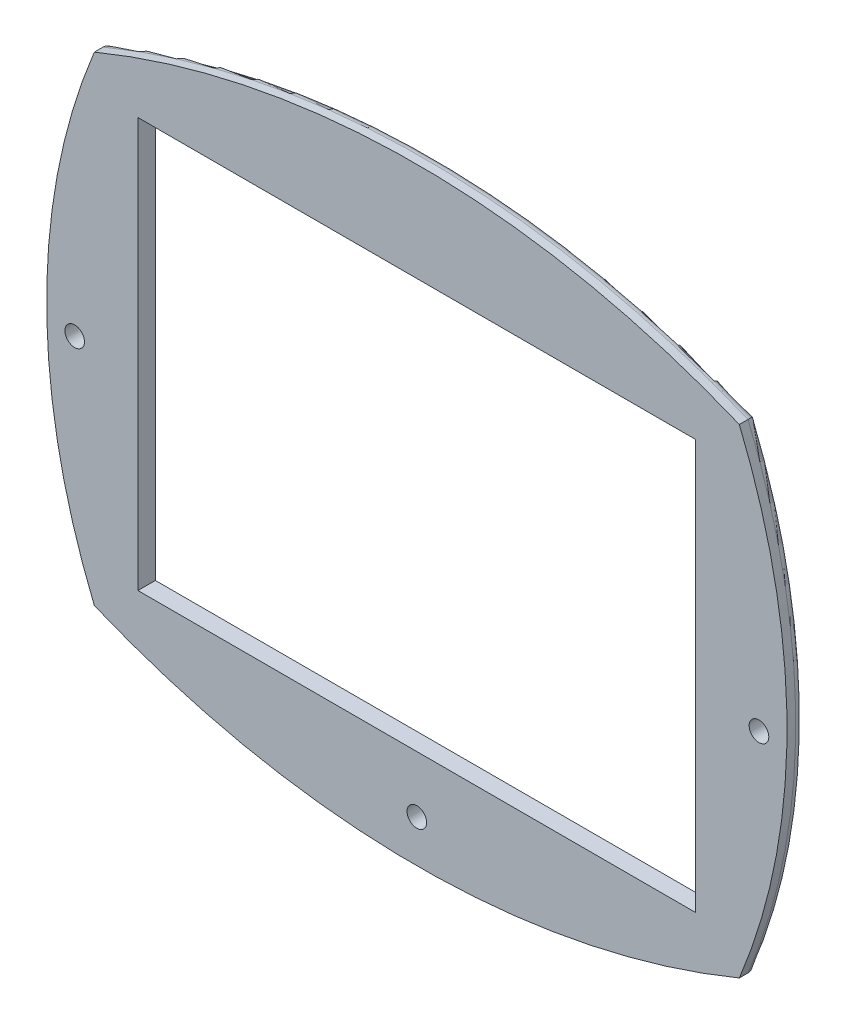
ISO-10303-21;
HEADER;
FILE_DESCRIPTION(('STEP AP214'),'2;1');
FILE_NAME('part.step','',(''),(''),'','','');
FILE_SCHEMA(('AUTOMOTIVE_DESIGN { 1 0 10303 214 1 1 1 1 }'));
ENDSEC;
DATA;
#1=APPLICATION_CONTEXT('core data for automotive mechanical design processes');
#2=APPLICATION_PROTOCOL_DEFINITION('international standard','automotive_design',2000,#1);
#3=PRODUCT_CONTEXT('',#1,'mechanical');
#4=PRODUCT('Part','Part','',(#3));
#5=PRODUCT_RELATED_PRODUCT_CATEGORY('part','',(#4));
#6=PRODUCT_DEFINITION_FORMATION('','',#4);
#7=PRODUCT_DEFINITION_CONTEXT('part definition',#1,'design');
#8=PRODUCT_DEFINITION('design','',#6,#7);
#9=PRODUCT_DEFINITION_SHAPE('','',#8);
#10=(LENGTH_UNIT() NAMED_UNIT(*) SI_UNIT(.MILLI.,.METRE.));
#11=(NAMED_UNIT(*) PLANE_ANGLE_UNIT() SI_UNIT($,.RADIAN.));
#12=(NAMED_UNIT(*) SI_UNIT($,.STERADIAN.) SOLID_ANGLE_UNIT());
#13=UNCERTAINTY_MEASURE_WITH_UNIT(LENGTH_MEASURE(1.E-05),#10,'distance_accuracy_value','');
#14=(GEOMETRIC_REPRESENTATION_CONTEXT(3) GLOBAL_UNCERTAINTY_ASSIGNED_CONTEXT((#13)) GLOBAL_UNIT_ASSIGNED_CONTEXT((#10,
#11,#12)) REPRESENTATION_CONTEXT('',''));
#15=CARTESIAN_POINT('',(0.,0.,0.));
#16=DIRECTION('',(0.,0.,1.));
#17=DIRECTION('',(1.,0.,0.));
#18=AXIS2_PLACEMENT_3D('',#15,#16,#17);
#19=CARTESIAN_POINT('',(-29.3908729652599,0.,2.));
#20=DIRECTION('',(0.,0.,-1.));
#21=DIRECTION('',(-1.,0.,0.));
#22=AXIS2_PLACEMENT_3D('',#19,#20,#21);
#23=CYLINDRICAL_SURFACE('',#22,71.8609630682005);
#24=DIRECTION('',(0.,0.,-1.));
#25=VECTOR('',#24,1.);
#26=CARTESIAN_POINT('',(36.9999999999999,-27.5,2.));
#27=LINE('',#26,#25);
#28=CARTESIAN_POINT('',(36.9999999999999,-27.5,2.));
#29=VERTEX_POINT('',#28);
#30=CARTESIAN_POINT('',(36.9999999999999,-27.5,1.));
#31=VERTEX_POINT('',#30);
#32=EDGE_CURVE('E144',#29,#31,#27,.T.);
#33=ORIENTED_EDGE('',*,*,#32,.T.);
#34=CARTESIAN_POINT('',(-29.3908729652599,0.,1.));
#35=DIRECTION('',(0.,0.,1.));
#36=DIRECTION('',(1.,0.,0.));
#37=AXIS2_PLACEMENT_3D('',#34,#35,#36);
#38=CIRCLE('',#37,71.8609630682005);
#39=CARTESIAN_POINT('',(37.,27.5,1.));
#40=VERTEX_POINT('',#39);
#41=EDGE_CURVE('E48',#31,#40,#38,.T.);
#42=ORIENTED_EDGE('',*,*,#41,.T.);
#43=DIRECTION('',(0.,0.,-1.));
#44=VECTOR('',#43,1.);
#45=CARTESIAN_POINT('',(37.,27.5,2.));
#46=LINE('',#45,#44);
#47=CARTESIAN_POINT('',(37.,27.5,2.));
#48=VERTEX_POINT('',#47);
#49=EDGE_CURVE('E156',#48,#40,#46,.T.);
#50=ORIENTED_EDGE('',*,*,#49,.F.);
#51=CARTESIAN_POINT('',(-29.3908729652599,0.,2.));
#52=DIRECTION('',(0.,0.,1.));
#53=DIRECTION('',(1.,0.,0.));
#54=AXIS2_PLACEMENT_3D('',#51,#52,#53);
#55=CIRCLE('',#54,71.8609630682005);
#56=EDGE_CURVE('E274',#48,#29,#55,.F.);
#57=ORIENTED_EDGE('',*,*,#56,.T.);
#58=EDGE_LOOP('',(#33,#42,#50,#57));
#59=FACE_BOUND('',#58,.T.);
#60=ADVANCED_FACE('F35',(#59),#23,.T.);
#61=CARTESIAN_POINT('',(0.,-61.8259018078043,2.));
#62=DIRECTION('',(0.,0.,-1.));
#63=DIRECTION('',(-1.,0.,0.));
#64=AXIS2_PLACEMENT_3D('',#61,#62,#63);
#65=CYLINDRICAL_SURFACE('',#64,96.6856594008517);
#66=ORIENTED_EDGE('',*,*,#49,.T.);
#67=CARTESIAN_POINT('',(0.,-61.8259018078043,1.));
#68=DIRECTION('',(0.,0.,1.));
#69=DIRECTION('',(1.,0.,0.));
#70=AXIS2_PLACEMENT_3D('',#67,#68,#69);
#71=CIRCLE('',#70,96.6856594008517);
#72=CARTESIAN_POINT('',(-37.,27.5,1.));
#73=VERTEX_POINT('',#72);
#74=EDGE_CURVE('E11',#40,#73,#71,.T.);
#75=ORIENTED_EDGE('',*,*,#74,.T.);
#76=DIRECTION('',(0.,0.,-1.));
#77=VECTOR('',#76,1.);
#78=CARTESIAN_POINT('',(-37.,27.5,2.));
#79=LINE('',#78,#77);
#80=CARTESIAN_POINT('',(-37.,27.5,2.));
#81=VERTEX_POINT('',#80);
#82=EDGE_CURVE('E295',#81,#73,#79,.T.);
#83=ORIENTED_EDGE('',*,*,#82,.F.);
#84=CARTESIAN_POINT('',(0.,-61.8259018078043,2.));
#85=DIRECTION('',(0.,0.,1.));
#86=DIRECTION('',(1.,0.,0.));
#87=AXIS2_PLACEMENT_3D('',#84,#85,#86);
#88=CIRCLE('',#87,96.6856594008517);
#89=EDGE_CURVE('E277',#81,#48,#88,.F.);
#90=ORIENTED_EDGE('',*,*,#89,.T.);
#91=EDGE_LOOP('',(#66,#75,#83,#90));
#92=FACE_BOUND('',#91,.T.);
#93=ADVANCED_FACE('F202',(#92),#65,.T.);
#94=CARTESIAN_POINT('',(29.3908729652599,0.,2.));
#95=DIRECTION('',(0.,0.,-1.));
#96=DIRECTION('',(-1.,0.,0.));
#97=AXIS2_PLACEMENT_3D('',#94,#95,#96);
#98=CYLINDRICAL_SURFACE('',#97,71.8609630682006);
#99=ORIENTED_EDGE('',*,*,#82,.T.);
#100=CARTESIAN_POINT('',(29.3908729652599,0.,1.));
#101=DIRECTION('',(0.,0.,1.));
#102=DIRECTION('',(1.,0.,0.));
#103=AXIS2_PLACEMENT_3D('',#100,#101,#102);
#104=CIRCLE('',#103,71.8609630682006);
#105=CARTESIAN_POINT('',(-37.,-27.5,1.));
#106=VERTEX_POINT('',#105);
#107=EDGE_CURVE('E152',#73,#106,#104,.T.);
#108=ORIENTED_EDGE('',*,*,#107,.T.);
#109=DIRECTION('',(0.,0.,-1.));
#110=VECTOR('',#109,1.);
#111=CARTESIAN_POINT('',(-37.,-27.5,2.));
#112=LINE('',#111,#110);
#113=CARTESIAN_POINT('',(-37.,-27.5,2.));
#114=VERTEX_POINT('',#113);
#115=EDGE_CURVE('E146',#114,#106,#112,.T.);
#116=ORIENTED_EDGE('',*,*,#115,.F.);
#117=CARTESIAN_POINT('',(29.3908729652599,0.,2.));
#118=DIRECTION('',(0.,0.,1.));
#119=DIRECTION('',(1.,0.,0.));
#120=AXIS2_PLACEMENT_3D('',#117,#118,#119);
#121=CIRCLE('',#120,71.8609630682006);
#122=EDGE_CURVE('E280',#81,#114,#121,.T.);
#123=ORIENTED_EDGE('',*,*,#122,.F.);
#124=EDGE_LOOP('',(#99,#108,#116,#123));
#125=FACE_BOUND('',#124,.T.);
#126=ADVANCED_FACE('F207',(#125),#98,.T.);
#127=CARTESIAN_POINT('',(0.,23.5,2.));
#128=DIRECTION('',(0.,1.,0.));
#129=DIRECTION('',(0.,0.,1.));
#130=AXIS2_PLACEMENT_3D('',#127,#128,#129);
#131=PLANE('',#130);
#132=DIRECTION('',(1.,0.,0.));
#133=VECTOR('',#132,1.);
#134=CARTESIAN_POINT('',(0.,23.5,0.));
#135=LINE('',#134,#133);
#136=CARTESIAN_POINT('',(-32.,23.5,0.));
#137=VERTEX_POINT('',#136);
#138=CARTESIAN_POINT('',(32.,23.5,0.));
#139=VERTEX_POINT('',#138);
#140=EDGE_CURVE('E143',#137,#139,#135,.T.);
#141=ORIENTED_EDGE('',*,*,#140,.T.);
#142=DIRECTION('',(0.,0.,-1.));
#143=VECTOR('',#142,1.);
#144=CARTESIAN_POINT('',(32.,23.5,2.));
#145=LINE('',#144,#143);
#146=CARTESIAN_POINT('',(32.,23.5,2.));
#147=VERTEX_POINT('',#146);
#148=EDGE_CURVE('E123',#147,#139,#145,.T.);
#149=ORIENTED_EDGE('',*,*,#148,.F.);
#150=DIRECTION('',(1.,0.,0.));
#151=VECTOR('',#150,1.);
#152=CARTESIAN_POINT('',(0.,23.5,2.));
#153=LINE('',#152,#151);
#154=CARTESIAN_POINT('',(-32.,23.5,2.));
#155=VERTEX_POINT('',#154);
#156=EDGE_CURVE('E130',#155,#147,#153,.T.);
#157=ORIENTED_EDGE('',*,*,#156,.F.);
#158=DIRECTION('',(0.,0.,-1.));
#159=VECTOR('',#158,1.);
#160=CARTESIAN_POINT('',(-32.,23.5,2.));
#161=LINE('',#160,#159);
#162=EDGE_CURVE('E285',#155,#137,#161,.T.);
#163=ORIENTED_EDGE('',*,*,#162,.T.);
#164=EDGE_LOOP('',(#141,#149,#157,#163));
#165=FACE_BOUND('',#164,.T.);
#166=ADVANCED_FACE('F141',(#165),#131,.F.);
#167=CARTESIAN_POINT('',(32.,0.,2.));
#168=DIRECTION('',(1.,0.,0.));
#169=DIRECTION('',(0.,1.,0.));
#170=AXIS2_PLACEMENT_3D('',#167,#168,#169);
#171=PLANE('',#170);
#172=DIRECTION('',(0.,-1.,0.));
#173=VECTOR('',#172,1.);
#174=CARTESIAN_POINT('',(32.,0.,0.));
#175=LINE('',#174,#173);
#176=CARTESIAN_POINT('',(32.,-23.5,0.));
#177=VERTEX_POINT('',#176);
#178=EDGE_CURVE('E287',#139,#177,#175,.T.);
#179=ORIENTED_EDGE('',*,*,#178,.T.);
#180=DIRECTION('',(0.,0.,-1.));
#181=VECTOR('',#180,1.);
#182=CARTESIAN_POINT('',(32.,-23.5,2.));
#183=LINE('',#182,#181);
#184=CARTESIAN_POINT('',(32.,-23.5,2.));
#185=VERTEX_POINT('',#184);
#186=EDGE_CURVE('E125',#185,#177,#183,.T.);
#187=ORIENTED_EDGE('',*,*,#186,.F.);
#188=DIRECTION('',(0.,-1.,0.));
#189=VECTOR('',#188,1.);
#190=CARTESIAN_POINT('',(32.,0.,2.));
#191=LINE('',#190,#189);
#192=EDGE_CURVE('E118',#147,#185,#191,.T.);
#193=ORIENTED_EDGE('',*,*,#192,.F.);
#194=ORIENTED_EDGE('',*,*,#148,.T.);
#195=EDGE_LOOP('',(#179,#187,#193,#194));
#196=FACE_BOUND('',#195,.T.);
#197=ADVANCED_FACE('F121',(#196),#171,.F.);
#198=CARTESIAN_POINT('',(0.,-23.5,2.));
#199=DIRECTION('',(0.,1.,0.));
#200=DIRECTION('',(0.,0.,1.));
#201=AXIS2_PLACEMENT_3D('',#198,#199,#200);
#202=PLANE('',#201);
#203=DIRECTION('',(1.,0.,0.));
#204=VECTOR('',#203,1.);
#205=CARTESIAN_POINT('',(0.,-23.5,0.));
#206=LINE('',#205,#204);
#207=CARTESIAN_POINT('',(-32.,-23.5,0.));
#208=VERTEX_POINT('',#207);
#209=EDGE_CURVE('E289',#208,#177,#206,.T.);
#210=ORIENTED_EDGE('',*,*,#209,.F.);
#211=DIRECTION('',(0.,0.,-1.));
#212=VECTOR('',#211,1.);
#213=CARTESIAN_POINT('',(-32.,-23.5,2.));
#214=LINE('',#213,#212);
#215=CARTESIAN_POINT('',(-32.,-23.5,2.));
#216=VERTEX_POINT('',#215);
#217=EDGE_CURVE('E148',#216,#208,#214,.T.);
#218=ORIENTED_EDGE('',*,*,#217,.F.);
#219=DIRECTION('',(1.,0.,0.));
#220=VECTOR('',#219,1.);
#221=CARTESIAN_POINT('',(0.,-23.5,2.));
#222=LINE('',#221,#220);
#223=EDGE_CURVE('E129',#216,#185,#222,.T.);
#224=ORIENTED_EDGE('',*,*,#223,.T.);
#225=ORIENTED_EDGE('',*,*,#186,.T.);
#226=EDGE_LOOP('',(#210,#218,#224,#225));
#227=FACE_BOUND('',#226,.T.);
#228=ADVANCED_FACE('F216',(#227),#202,.T.);
#229=CARTESIAN_POINT('',(-32.,0.,2.));
#230=DIRECTION('',(1.,0.,0.));
#231=DIRECTION('',(0.,1.,0.));
#232=AXIS2_PLACEMENT_3D('',#229,#230,#231);
#233=PLANE('',#232);
#234=DIRECTION('',(0.,-1.,0.));
#235=VECTOR('',#234,1.);
#236=CARTESIAN_POINT('',(-32.,0.,0.));
#237=LINE('',#236,#235);
#238=EDGE_CURVE('E139',#137,#208,#237,.T.);
#239=ORIENTED_EDGE('',*,*,#238,.F.);
#240=ORIENTED_EDGE('',*,*,#162,.F.);
#241=DIRECTION('',(0.,-1.,0.));
#242=VECTOR('',#241,1.);
#243=CARTESIAN_POINT('',(-32.,0.,2.));
#244=LINE('',#243,#242);
#245=EDGE_CURVE('E137',#155,#216,#244,.T.);
#246=ORIENTED_EDGE('',*,*,#245,.T.);
#247=ORIENTED_EDGE('',*,*,#217,.T.);
#248=EDGE_LOOP('',(#239,#240,#246,#247));
#249=FACE_BOUND('',#248,.T.);
#250=ADVANCED_FACE('F212',(#249),#233,.T.);
#251=CARTESIAN_POINT('',(0.,61.8259018078043,2.));
#252=DIRECTION('',(0.,0.,-1.));
#253=DIRECTION('',(-1.,0.,0.));
#254=AXIS2_PLACEMENT_3D('',#251,#252,#253);
#255=CYLINDRICAL_SURFACE('',#254,96.6856594008516);
#256=ORIENTED_EDGE('',*,*,#115,.T.);
#257=CARTESIAN_POINT('',(0.,61.8259018078043,1.));
#258=DIRECTION('',(0.,0.,1.));
#259=DIRECTION('',(1.,0.,0.));
#260=AXIS2_PLACEMENT_3D('',#257,#258,#259);
#261=CIRCLE('',#260,96.6856594008516);
#262=EDGE_CURVE('E63',#106,#31,#261,.T.);
#263=ORIENTED_EDGE('',*,*,#262,.T.);
#264=ORIENTED_EDGE('',*,*,#32,.F.);
#265=CARTESIAN_POINT('',(0.,61.8259018078043,2.));
#266=DIRECTION('',(0.,0.,1.));
#267=DIRECTION('',(1.,0.,0.));
#268=AXIS2_PLACEMENT_3D('',#265,#266,#267);
#269=CIRCLE('',#268,96.6856594008516);
#270=EDGE_CURVE('E283',#114,#29,#269,.T.);
#271=ORIENTED_EDGE('',*,*,#270,.F.);
#272=EDGE_LOOP('',(#256,#263,#264,#271));
#273=FACE_BOUND('',#272,.T.);
#274=ADVANCED_FACE('F215',(#273),#255,.T.);
#275=CARTESIAN_POINT('',(0.,0.,2.));
#276=DIRECTION('',(0.,0.,1.));
#277=DIRECTION('',(1.,0.,0.));
#278=AXIS2_PLACEMENT_3D('',#275,#276,#277);
#279=PLANE('',#278);
#280=CARTESIAN_POINT('',(-39.2539323735273,-1.85999999999998,2.));
#281=DIRECTION('',(0.,0.,-1.));
#282=DIRECTION('',(-1.,0.,0.));
#283=AXIS2_PLACEMENT_3D('',#280,#281,#282);
#284=CIRCLE('',#283,1.125);
#285=CARTESIAN_POINT('',(-40.3789323735273,-1.85999999999998,2.));
#286=VERTEX_POINT('',#285);
#287=EDGE_CURVE('E254',#286,#286,#284,.T.);
#288=ORIENTED_EDGE('',*,*,#287,.T.);
#289=EDGE_LOOP('',(#288));
#290=FACE_BOUND('',#289,.T.);
#291=CARTESIAN_POINT('',(0.,-30.,2.));
#292=DIRECTION('',(0.,0.,-1.));
#293=DIRECTION('',(-1.,0.,0.));
#294=AXIS2_PLACEMENT_3D('',#291,#292,#293);
#295=CIRCLE('',#294,1.125);
#296=CARTESIAN_POINT('',(-1.125,-30.,2.));
#297=VERTEX_POINT('',#296);
#298=EDGE_CURVE('E262',#297,#297,#295,.T.);
#299=ORIENTED_EDGE('',*,*,#298,.T.);
#300=EDGE_LOOP('',(#299));
#301=FACE_BOUND('',#300,.T.);
#302=CARTESIAN_POINT('',(39.2539323735273,-1.86000000000003,2.));
#303=DIRECTION('',(0.,0.,-1.));
#304=DIRECTION('',(-1.,0.,0.));
#305=AXIS2_PLACEMENT_3D('',#302,#303,#304);
#306=CIRCLE('',#305,1.125);
#307=CARTESIAN_POINT('',(38.1289323735273,-1.86000000000003,2.));
#308=VERTEX_POINT('',#307);
#309=EDGE_CURVE('E175',#308,#308,#306,.T.);
#310=ORIENTED_EDGE('',*,*,#309,.T.);
#311=EDGE_LOOP('',(#310));
#312=FACE_BOUND('',#311,.T.);
#313=ORIENTED_EDGE('',*,*,#156,.T.);
#314=ORIENTED_EDGE('',*,*,#192,.T.);
#315=ORIENTED_EDGE('',*,*,#223,.F.);
#316=ORIENTED_EDGE('',*,*,#245,.F.);
#317=EDGE_LOOP('',(#313,#314,#315,#316));
#318=FACE_BOUND('',#317,.T.);
#319=ORIENTED_EDGE('',*,*,#56,.F.);
#320=ORIENTED_EDGE('',*,*,#89,.F.);
#321=ORIENTED_EDGE('',*,*,#122,.T.);
#322=ORIENTED_EDGE('',*,*,#270,.T.);
#323=EDGE_LOOP('',(#319,#320,#321,#322));
#324=FACE_BOUND('',#323,.T.);
#325=ADVANCED_FACE('F134',(#290,#301,#312,#318,#324),#279,.T.);
#326=CARTESIAN_POINT('',(0.,0.,0.));
#327=DIRECTION('',(0.,0.,1.));
#328=DIRECTION('',(1.,0.,0.));
#329=AXIS2_PLACEMENT_3D('',#326,#327,#328);
#330=PLANE('',#329);
#331=CARTESIAN_POINT('',(-39.2539323735273,-1.85999999999998,0.));
#332=DIRECTION('',(0.,0.,-1.));
#333=DIRECTION('',(-1.,0.,0.));
#334=AXIS2_PLACEMENT_3D('',#331,#332,#333);
#335=CIRCLE('',#334,1.125);
#336=CARTESIAN_POINT('',(-40.3789323735273,-1.85999999999998,0.));
#337=VERTEX_POINT('',#336);
#338=EDGE_CURVE('E257',#337,#337,#335,.T.);
#339=ORIENTED_EDGE('',*,*,#338,.F.);
#340=EDGE_LOOP('',(#339));
#341=FACE_BOUND('',#340,.T.);
#342=CARTESIAN_POINT('',(0.,-30.,0.));
#343=DIRECTION('',(0.,0.,-1.));
#344=DIRECTION('',(-1.,0.,0.));
#345=AXIS2_PLACEMENT_3D('',#342,#343,#344);
#346=CIRCLE('',#345,1.125);
#347=CARTESIAN_POINT('',(-1.125,-30.,0.));
#348=VERTEX_POINT('',#347);
#349=EDGE_CURVE('E259',#348,#348,#346,.T.);
#350=ORIENTED_EDGE('',*,*,#349,.F.);
#351=EDGE_LOOP('',(#350));
#352=FACE_BOUND('',#351,.T.);
#353=CARTESIAN_POINT('',(39.2539323735273,-1.86000000000003,0.));
#354=DIRECTION('',(0.,0.,-1.));
#355=DIRECTION('',(-1.,0.,0.));
#356=AXIS2_PLACEMENT_3D('',#353,#354,#355);
#357=CIRCLE('',#356,1.125);
#358=CARTESIAN_POINT('',(38.1289323735273,-1.86000000000003,0.));
#359=VERTEX_POINT('',#358);
#360=EDGE_CURVE('E265',#359,#359,#357,.T.);
#361=ORIENTED_EDGE('',*,*,#360,.F.);
#362=EDGE_LOOP('',(#361));
#363=FACE_BOUND('',#362,.T.);
#364=CARTESIAN_POINT('',(0.,61.8259018078043,0.));
#365=DIRECTION('',(0.,0.,1.));
#366=DIRECTION('',(1.,0.,0.));
#367=AXIS2_PLACEMENT_3D('',#364,#365,#366);
#368=CIRCLE('',#367,95.6856594008516);
#369=CARTESIAN_POINT('',(36.2335379982626,-26.7341125276973,0.));
#370=VERTEX_POINT('',#369);
#371=CARTESIAN_POINT('',(-36.2335379982627,-26.7341125276973,0.));
#372=VERTEX_POINT('',#371);
#373=EDGE_CURVE('E160',#370,#372,#368,.F.);
#374=ORIENTED_EDGE('',*,*,#373,.T.);
#375=CARTESIAN_POINT('',(29.3908729652599,0.,0.));
#376=DIRECTION('',(0.,0.,1.));
#377=DIRECTION('',(1.,0.,0.));
#378=AXIS2_PLACEMENT_3D('',#375,#376,#377);
#379=CIRCLE('',#378,70.8609630682006);
#380=CARTESIAN_POINT('',(-36.2335379982626,26.7341125276973,0.));
#381=VERTEX_POINT('',#380);
#382=EDGE_CURVE('E162',#372,#381,#379,.F.);
#383=ORIENTED_EDGE('',*,*,#382,.T.);
#384=CARTESIAN_POINT('',(0.,-61.8259018078043,0.));
#385=DIRECTION('',(0.,0.,1.));
#386=DIRECTION('',(1.,0.,0.));
#387=AXIS2_PLACEMENT_3D('',#384,#385,#386);
#388=CIRCLE('',#387,95.6856594008517);
#389=CARTESIAN_POINT('',(36.2335379982626,26.7341125276973,0.));
#390=VERTEX_POINT('',#389);
#391=EDGE_CURVE('E155',#381,#390,#388,.F.);
#392=ORIENTED_EDGE('',*,*,#391,.T.);
#393=CARTESIAN_POINT('',(-29.3908729652599,0.,0.));
#394=DIRECTION('',(0.,0.,1.));
#395=DIRECTION('',(1.,0.,0.));
#396=AXIS2_PLACEMENT_3D('',#393,#394,#395);
#397=CIRCLE('',#396,70.8609630682005);
#398=EDGE_CURVE('E158',#390,#370,#397,.F.);
#399=ORIENTED_EDGE('',*,*,#398,.T.);
#400=EDGE_LOOP('',(#374,#383,#392,#399));
#401=FACE_BOUND('',#400,.T.);
#402=ORIENTED_EDGE('',*,*,#140,.F.);
#403=ORIENTED_EDGE('',*,*,#238,.T.);
#404=ORIENTED_EDGE('',*,*,#209,.T.);
#405=ORIENTED_EDGE('',*,*,#178,.F.);
#406=EDGE_LOOP('',(#402,#403,#404,#405));
#407=FACE_BOUND('',#406,.T.);
#408=ADVANCED_FACE('F198',(#341,#352,#363,#401,#407),#330,.F.);
#409=CARTESIAN_POINT('',(-29.3908729652599,0.,1.));
#410=DIRECTION('',(0.,0.,1.));
#411=DIRECTION('',(1.,0.,0.));
#412=AXIS2_PLACEMENT_3D('',#409,#410,#411);
#413=TOROIDAL_SURFACE('',#412,70.8609630682005,1.);
#414=CARTESIAN_POINT('',(36.9999999999999,-27.5,1.));
#415=CARTESIAN_POINT('',(37.0000006454729,-27.5000006517377,0.9734140534353));
#416=CARTESIAN_POINT('',(36.9991879715394,-27.4991879709086,0.946841431281818));
#417=CARTESIAN_POINT('',(36.9959511433835,-27.4959511554365,0.89389852892022));
#418=CARTESIAN_POINT('',(36.9935273146641,-27.4935273462913,0.867528208929138));
#419=CARTESIAN_POINT('',(36.9838846586652,-27.4838848674329,0.789157604832926));
#420=CARTESIAN_POINT('',(36.9742944073282,-27.4742948913634,0.737702750726048));
#421=CARTESIAN_POINT('',(36.9491737207126,-27.4491760697353,0.637838057785487));
#422=CARTESIAN_POINT('',(36.9336448629545,-27.4336488013482,0.589427414266572));
#423=CARTESIAN_POINT('',(36.8972250142863,-27.3972349214859,0.49680995740899));
#424=CARTESIAN_POINT('',(36.8763320213308,-27.3763463090078,0.452604722107335));
#425=CARTESIAN_POINT('',(36.829173576208,-27.3292013058199,0.368109779698057));
#426=CARTESIAN_POINT('',(36.8027616582633,-27.302798590231,0.327983931453884));
#427=CARTESIAN_POINT('',(36.7458320880646,-27.2458939930585,0.254054363943943));
#428=CARTESIAN_POINT('',(36.7153131292371,-27.2153908069952,0.220252664793814));
#429=CARTESIAN_POINT('',(36.6487024678975,-27.1488212483041,0.157341582201635));
#430=CARTESIAN_POINT('',(36.6123675196812,-27.1125122376759,0.128747055956251));
#431=CARTESIAN_POINT('',(36.5369768041409,-27.0371841223175,0.0799144107795119));
#432=CARTESIAN_POINT('',(36.4979200433044,-26.9981640280067,0.05967936208369));
#433=CARTESIAN_POINT('',(36.4223677164697,-26.9226918435645,0.0295346193055102));
#434=CARTESIAN_POINT('',(36.3860437753347,-26.8864102336682,0.0187533263601759));
#435=CARTESIAN_POINT('',(36.312747856409,-26.8132078911422,0.00417115700707229));
#436=CARTESIAN_POINT('',(36.2757773344348,-26.7762885961664,0.000356236665000513));
#437=CARTESIAN_POINT('',(36.2370682791797,-26.7376374949193,7.91473840324419E-06));
#438=CARTESIAN_POINT('',(36.2353030871475,-26.7358749550942,-1.88588959210333E-08));
#439=CARTESIAN_POINT('',(36.2335379982626,-26.7341125276973,0.));
#440=B_SPLINE_CURVE_WITH_KNOTS('',3,(#414,#415,#416,#417,#418,#419,#420,#421,#422,#423,#424,
#425,#426,#427,#428,#429,#430,#431,#432,#433,#434,#435,#436,#437,#438,#439),.UNSPECIFIED.,.F.,
.F.,(4,2,2,2,2,2,2,2,2,2,2,2,4),(0.,0.0797068473752799,0.159397596395946,0.318202053349221,
0.476964355047411,0.635785997639765,0.799531021873472,0.963328262022708,1.13894942403484,
1.3146350302649,1.47156745540758,1.62818316017986,1.63566658992668),.UNSPECIFIED.);
#441=EDGE_CURVE('E309',#370,#31,#440,.F.);
#442=ORIENTED_EDGE('',*,*,#441,.F.);
#443=ORIENTED_EDGE('',*,*,#398,.F.);
#444=CARTESIAN_POINT('',(37.,27.5,1.));
#445=CARTESIAN_POINT('',(37.0000006454729,27.5000006517377,0.9734140534353));
#446=CARTESIAN_POINT('',(36.9991879715394,27.4991879709086,0.946841431281819));
#447=CARTESIAN_POINT('',(36.9959511433835,27.4959511554365,0.893898528920222));
#448=CARTESIAN_POINT('',(36.9935273146641,27.4935273462913,0.867528208929139));
#449=CARTESIAN_POINT('',(36.9838846586652,27.4838848674329,0.789157604832926));
#450=CARTESIAN_POINT('',(36.9742944073282,27.4742948913634,0.737702750726046));
#451=CARTESIAN_POINT('',(36.9491737207126,27.4491760697354,0.637838057785486));
#452=CARTESIAN_POINT('',(36.9336448629545,27.4336488013482,0.589427414266573));
#453=CARTESIAN_POINT('',(36.8972250142863,27.3972349214859,0.496809957408991));
#454=CARTESIAN_POINT('',(36.8763320213308,27.3763463090078,0.452604722107335));
#455=CARTESIAN_POINT('',(36.829173576208,27.3292013058199,0.368109779698059));
#456=CARTESIAN_POINT('',(36.8027616582633,27.302798590231,0.32798393145389));
#457=CARTESIAN_POINT('',(36.7458320880646,27.2458939930585,0.25405436394395));
#458=CARTESIAN_POINT('',(36.7153131292371,27.2153908069952,0.220252664793819));
#459=CARTESIAN_POINT('',(36.6487024678975,27.1488212483041,0.157341582201634));
#460=CARTESIAN_POINT('',(36.6123675196812,27.1125122376759,0.128747055956247));
#461=CARTESIAN_POINT('',(36.5369768041409,27.0371841223174,0.0799144107795054));
#462=CARTESIAN_POINT('',(36.4979200433044,26.9981640280067,0.0596793620836843));
#463=CARTESIAN_POINT('',(36.4223677164697,26.9226918435645,0.0295346193055072));
#464=CARTESIAN_POINT('',(36.3860437753347,26.8864102336682,0.0187533263601742));
#465=CARTESIAN_POINT('',(36.312747856409,26.8132078911422,0.00417115700707158));
#466=CARTESIAN_POINT('',(36.2757773344348,26.7762885961664,0.000356236664999347));
#467=CARTESIAN_POINT('',(36.2370682791797,26.7376374949193,7.91473840312529E-06));
#468=CARTESIAN_POINT('',(36.2353030871475,26.7358749550943,-1.8858895988277E-08));
#469=CARTESIAN_POINT('',(36.2335379982626,26.7341125276973,0.));
#470=B_SPLINE_CURVE_WITH_KNOTS('',3,(#444,#445,#446,#447,#448,#449,#450,#451,#452,#453,#454,
#455,#456,#457,#458,#459,#460,#461,#462,#463,#464,#465,#466,#467,#468,#469),.UNSPECIFIED.,.F.,
.F.,(4,2,2,2,2,2,2,2,2,2,2,2,4),(0.,0.0797068473752787,0.159397596395946,0.318202053349222,
0.47696435504741,0.635785997639768,0.79953102187347,0.963328262022713,1.13894942403485,
1.31463503026491,1.47156745540759,1.62818316017985,1.63566658992667),.UNSPECIFIED.);
#471=EDGE_CURVE('E40',#40,#390,#470,.T.);
#472=ORIENTED_EDGE('',*,*,#471,.F.);
#473=ORIENTED_EDGE('',*,*,#41,.F.);
#474=EDGE_LOOP('',(#442,#443,#472,#473));
#475=FACE_BOUND('',#474,.T.);
#476=ADVANCED_FACE('F37',(#475),#413,.T.);
#477=CARTESIAN_POINT('',(0.,-61.8259018078043,1.));
#478=DIRECTION('',(0.,0.,1.));
#479=DIRECTION('',(1.,0.,0.));
#480=AXIS2_PLACEMENT_3D('',#477,#478,#479);
#481=TOROIDAL_SURFACE('',#480,95.6856594008517,1.);
#482=ORIENTED_EDGE('',*,*,#471,.T.);
#483=ORIENTED_EDGE('',*,*,#391,.F.);
#484=CARTESIAN_POINT('',(-37.,27.5,1.));
#485=CARTESIAN_POINT('',(-37.0000006454729,27.5000006517378,0.9734140534353));
#486=CARTESIAN_POINT('',(-36.9991879715394,27.4991879709086,0.946841431281819));
#487=CARTESIAN_POINT('',(-36.9959511433835,27.4959511554365,0.893898528920222));
#488=CARTESIAN_POINT('',(-36.9935273146642,27.4935273462913,0.86752820892914));
#489=CARTESIAN_POINT('',(-36.9838846586653,27.4838848674328,0.789157604832927));
#490=CARTESIAN_POINT('',(-36.9742944073283,27.4742948913634,0.737702750726047));
#491=CARTESIAN_POINT('',(-36.9491737207126,27.4491760697353,0.637838057785485));
#492=CARTESIAN_POINT('',(-36.9336448629545,27.4336488013482,0.589427414266569));
#493=CARTESIAN_POINT('',(-36.8972250142864,27.3972349214859,0.496809957408991));
#494=CARTESIAN_POINT('',(-36.8763320213308,27.3763463090078,0.452604722107339));
#495=CARTESIAN_POINT('',(-36.829173576208,27.3292013058199,0.368109779698058));
#496=CARTESIAN_POINT('',(-36.8027616582634,27.302798590231,0.327983931453877));
#497=CARTESIAN_POINT('',(-36.7458320880646,27.2458939930585,0.254054363943937));
#498=CARTESIAN_POINT('',(-36.7153131292372,27.2153908069952,0.220252664793815));
#499=CARTESIAN_POINT('',(-36.6487024678975,27.1488212483041,0.157341582201639));
#500=CARTESIAN_POINT('',(-36.6123675196812,27.1125122376759,0.12874705595625));
#501=CARTESIAN_POINT('',(-36.5369768041409,27.0371841223175,0.0799144107795071));
#502=CARTESIAN_POINT('',(-36.4979200433045,26.9981640280067,0.0596793620836884));
#503=CARTESIAN_POINT('',(-36.4223677164697,26.9226918435645,0.0295346193055116));
#504=CARTESIAN_POINT('',(-36.3860437753348,26.8864102336682,0.0187533263601768));
#505=CARTESIAN_POINT('',(-36.3127478564091,26.8132078911422,0.00417115700707341));
#506=CARTESIAN_POINT('',(-36.2757773344349,26.7762885961664,0.000356236665002395));
#507=CARTESIAN_POINT('',(-36.2370682791798,26.7376374949193,7.9147384033891E-06));
#508=CARTESIAN_POINT('',(-36.2353030871475,26.7358749550943,-1.88588958595792E-08));
#509=CARTESIAN_POINT('',(-36.2335379982626,26.7341125276973,0.));
#510=B_SPLINE_CURVE_WITH_KNOTS('',3,(#484,#485,#486,#487,#488,#489,#490,#491,#492,#493,#494,
#495,#496,#497,#498,#499,#500,#501,#502,#503,#504,#505,#506,#507,#508,#509),.UNSPECIFIED.,.F.,
.F.,(4,2,2,2,2,2,2,2,2,2,2,2,4),(0.,0.0797068473752787,0.159397596395946,0.31820205334922,
0.476964355047409,0.635785997639769,0.799531021873475,0.963328262022712,1.13894942403484,
1.3146350302649,1.47156745540757,1.62818316017983,1.63566658992666),.UNSPECIFIED.);
#511=EDGE_CURVE('E174',#73,#381,#510,.T.);
#512=ORIENTED_EDGE('',*,*,#511,.F.);
#513=ORIENTED_EDGE('',*,*,#74,.F.);
#514=EDGE_LOOP('',(#482,#483,#512,#513));
#515=FACE_BOUND('',#514,.T.);
#516=ADVANCED_FACE('F187',(#515),#481,.T.);
#517=CARTESIAN_POINT('',(0.,61.8259018078043,1.));
#518=DIRECTION('',(0.,0.,1.));
#519=DIRECTION('',(1.,0.,0.));
#520=AXIS2_PLACEMENT_3D('',#517,#518,#519);
#521=TOROIDAL_SURFACE('',#520,95.6856594008516,1.);
#522=ORIENTED_EDGE('',*,*,#441,.T.);
#523=ORIENTED_EDGE('',*,*,#262,.F.);
#524=CARTESIAN_POINT('',(-37.,-27.5,1.));
#525=CARTESIAN_POINT('',(-37.0000006454729,-27.5000006517377,0.973414053435301));
#526=CARTESIAN_POINT('',(-36.9991879715394,-27.4991879709086,0.946841431281821));
#527=CARTESIAN_POINT('',(-36.9959511433835,-27.4959511554365,0.893898528920223));
#528=CARTESIAN_POINT('',(-36.9935273146642,-27.4935273462912,0.867528208929139));
#529=CARTESIAN_POINT('',(-36.9838846586653,-27.4838848674328,0.789157604832925));
#530=CARTESIAN_POINT('',(-36.9742944073283,-27.4742948913634,0.737702750726043));
#531=CARTESIAN_POINT('',(-36.9491737207126,-27.4491760697353,0.637838057785486));
#532=CARTESIAN_POINT('',(-36.9336448629545,-27.4336488013482,0.589427414266577));
#533=CARTESIAN_POINT('',(-36.8972250142864,-27.3972349214859,0.496809957409));
#534=CARTESIAN_POINT('',(-36.8763320213308,-27.3763463090078,0.452604722107343));
#535=CARTESIAN_POINT('',(-36.829173576208,-27.3292013058199,0.368109779698066));
#536=CARTESIAN_POINT('',(-36.8027616582634,-27.3027985902309,0.327983931453895));
#537=CARTESIAN_POINT('',(-36.7458320880646,-27.2458939930585,0.254054363943956));
#538=CARTESIAN_POINT('',(-36.7153131292372,-27.2153908069952,0.220252664793826));
#539=CARTESIAN_POINT('',(-36.6487024678975,-27.1488212483041,0.157341582201642));
#540=CARTESIAN_POINT('',(-36.6123675196812,-27.1125122376759,0.128747055956254));
#541=CARTESIAN_POINT('',(-36.536976804141,-27.0371841223174,0.0799144107795108));
#542=CARTESIAN_POINT('',(-36.4979200433045,-26.9981640280067,0.0596793620836893));
#543=CARTESIAN_POINT('',(-36.4223677164698,-26.9226918435645,0.0295346193055112));
#544=CARTESIAN_POINT('',(-36.3860437753348,-26.8864102336682,0.0187533263601779));
#545=CARTESIAN_POINT('',(-36.3127478564091,-26.8132078911422,0.00417115700707416));
#546=CARTESIAN_POINT('',(-36.2757773344348,-26.7762885961664,0.000356236665001687));
#547=CARTESIAN_POINT('',(-36.2370682791798,-26.7376374949193,7.91473840332328E-06));
#548=CARTESIAN_POINT('',(-36.2353030871475,-26.7358749550942,-1.88588958916621E-08));
#549=CARTESIAN_POINT('',(-36.2335379982627,-26.7341125276973,0.));
#550=B_SPLINE_CURVE_WITH_KNOTS('',3,(#524,#525,#526,#527,#528,#529,#530,#531,#532,#533,#534,
#535,#536,#537,#538,#539,#540,#541,#542,#543,#544,#545,#546,#547,#548,#549),.UNSPECIFIED.,.F.,
.F.,(4,2,2,2,2,2,2,2,2,2,2,2,4),(0.,0.0797068473752776,0.159397596395946,0.318202053349216,
0.476964355047405,0.635785997639767,0.799531021873466,0.963328262022697,1.13894942403483,
1.31463503026489,1.47156745540757,1.62818316017985,1.63566658992667),.UNSPECIFIED.);
#551=EDGE_CURVE('E167',#372,#106,#550,.F.);
#552=ORIENTED_EDGE('',*,*,#551,.F.);
#553=ORIENTED_EDGE('',*,*,#373,.F.);
#554=EDGE_LOOP('',(#522,#523,#552,#553));
#555=FACE_BOUND('',#554,.T.);
#556=ADVANCED_FACE('F179',(#555),#521,.T.);
#557=CARTESIAN_POINT('',(29.3908729652599,0.,1.));
#558=DIRECTION('',(0.,0.,1.));
#559=DIRECTION('',(1.,0.,0.));
#560=AXIS2_PLACEMENT_3D('',#557,#558,#559);
#561=TOROIDAL_SURFACE('',#560,70.8609630682006,1.);
#562=ORIENTED_EDGE('',*,*,#511,.T.);
#563=ORIENTED_EDGE('',*,*,#382,.F.);
#564=ORIENTED_EDGE('',*,*,#551,.T.);
#565=ORIENTED_EDGE('',*,*,#107,.F.);
#566=EDGE_LOOP('',(#562,#563,#564,#565));
#567=FACE_BOUND('',#566,.T.);
#568=ADVANCED_FACE('F182',(#567),#561,.T.);
#569=CARTESIAN_POINT('',(39.2539323735273,-1.86000000000003,2.));
#570=DIRECTION('',(0.,0.,-1.));
#571=DIRECTION('',(-1.,0.,0.));
#572=AXIS2_PLACEMENT_3D('',#569,#570,#571);
#573=CYLINDRICAL_SURFACE('',#572,1.125);
#574=ORIENTED_EDGE('',*,*,#309,.F.);
#575=EDGE_LOOP('',(#574));
#576=FACE_BOUND('',#575,.T.);
#577=ORIENTED_EDGE('',*,*,#360,.T.);
#578=EDGE_LOOP('',(#577));
#579=FACE_BOUND('',#578,.T.);
#580=ADVANCED_FACE('F185',(#576,#579),#573,.F.);
#581=CARTESIAN_POINT('',(0.,-30.,2.));
#582=DIRECTION('',(0.,0.,-1.));
#583=DIRECTION('',(-1.,0.,0.));
#584=AXIS2_PLACEMENT_3D('',#581,#582,#583);
#585=CYLINDRICAL_SURFACE('',#584,1.125);
#586=ORIENTED_EDGE('',*,*,#298,.F.);
#587=EDGE_LOOP('',(#586));
#588=FACE_BOUND('',#587,.T.);
#589=ORIENTED_EDGE('',*,*,#349,.T.);
#590=EDGE_LOOP('',(#589));
#591=FACE_BOUND('',#590,.T.);
#592=ADVANCED_FACE('F241',(#588,#591),#585,.F.);
#593=CARTESIAN_POINT('',(-39.2539323735273,-1.85999999999998,2.));
#594=DIRECTION('',(0.,0.,-1.));
#595=DIRECTION('',(-1.,0.,0.));
#596=AXIS2_PLACEMENT_3D('',#593,#594,#595);
#597=CYLINDRICAL_SURFACE('',#596,1.125);
#598=ORIENTED_EDGE('',*,*,#287,.F.);
#599=EDGE_LOOP('',(#598));
#600=FACE_BOUND('',#599,.T.);
#601=ORIENTED_EDGE('',*,*,#338,.T.);
#602=EDGE_LOOP('',(#601));
#603=FACE_BOUND('',#602,.T.);
#604=ADVANCED_FACE('F245',(#600,#603),#597,.F.);
#605=CLOSED_SHELL('',(#60,#93,#126,#166,#197,#228,#250,#274,#325,#408,#476,#516,#556,#568,#580,
#592,#604));
#606=MANIFOLD_SOLID_BREP('B2',#605);
#607=ADVANCED_BREP_SHAPE_REPRESENTATION('',(#18,#606),#14);
#608=SHAPE_DEFINITION_REPRESENTATION(#9,#607);
ENDSEC;
END-ISO-10303-21;
